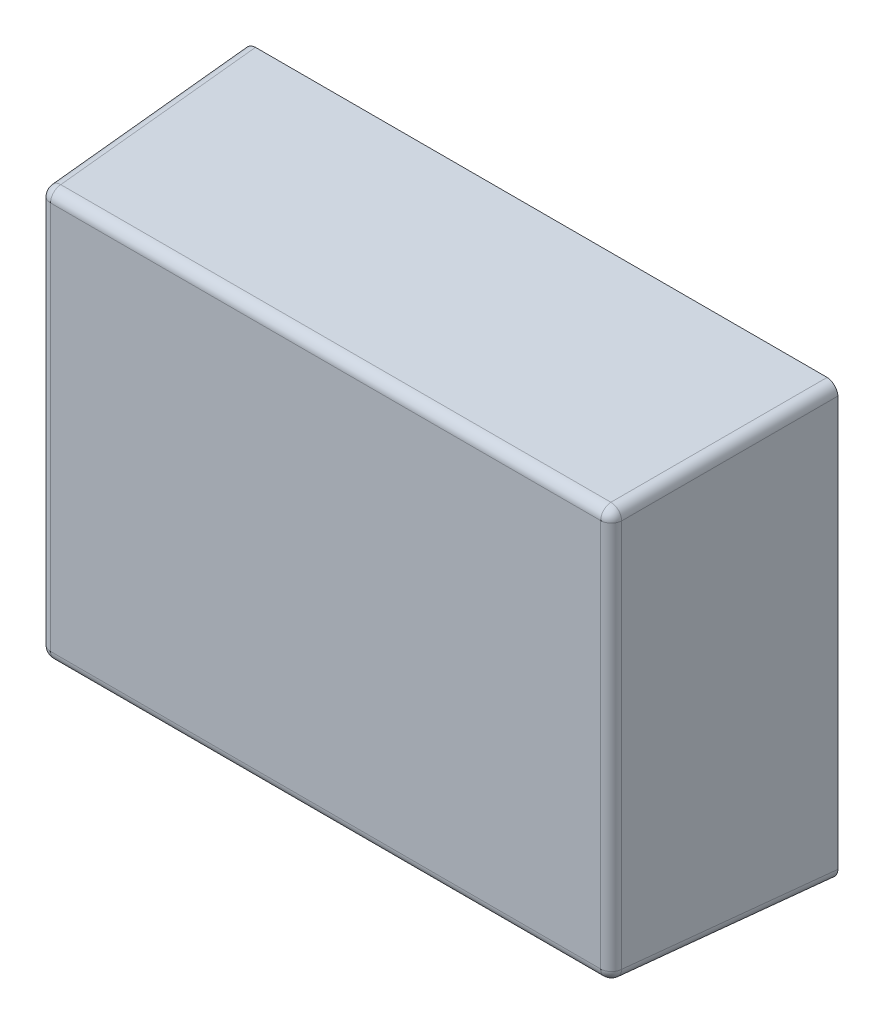
ISO-10303-21;
HEADER;
FILE_DESCRIPTION(('STEP AP214'),'2;1');
FILE_NAME('part.step','',(''),(''),'','','');
FILE_SCHEMA(('AUTOMOTIVE_DESIGN { 1 0 10303 214 1 1 1 1 }'));
ENDSEC;
DATA;
#1=APPLICATION_CONTEXT('core data for automotive mechanical design processes');
#2=APPLICATION_PROTOCOL_DEFINITION('international standard','automotive_design',2000,#1);
#3=PRODUCT_CONTEXT('',#1,'mechanical');
#4=PRODUCT('Part','Part','',(#3));
#5=PRODUCT_RELATED_PRODUCT_CATEGORY('part','',(#4));
#6=PRODUCT_DEFINITION_FORMATION('','',#4);
#7=PRODUCT_DEFINITION_CONTEXT('part definition',#1,'design');
#8=PRODUCT_DEFINITION('design','',#6,#7);
#9=PRODUCT_DEFINITION_SHAPE('','',#8);
#10=(LENGTH_UNIT() NAMED_UNIT(*) SI_UNIT(.MILLI.,.METRE.));
#11=(NAMED_UNIT(*) PLANE_ANGLE_UNIT() SI_UNIT($,.RADIAN.));
#12=(NAMED_UNIT(*) SI_UNIT($,.STERADIAN.) SOLID_ANGLE_UNIT());
#13=UNCERTAINTY_MEASURE_WITH_UNIT(LENGTH_MEASURE(1.E-05),#10,'distance_accuracy_value','');
#14=(GEOMETRIC_REPRESENTATION_CONTEXT(3) GLOBAL_UNCERTAINTY_ASSIGNED_CONTEXT((#13)) GLOBAL_UNIT_ASSIGNED_CONTEXT((#10,
#11,#12)) REPRESENTATION_CONTEXT('',''));
#15=CARTESIAN_POINT('',(0.,0.,0.));
#16=DIRECTION('',(0.,0.,1.));
#17=DIRECTION('',(1.,0.,0.));
#18=AXIS2_PLACEMENT_3D('',#15,#16,#17);
#19=CARTESIAN_POINT('',(-0.55,0.,0.));
#20=DIRECTION('',(-0.998629534754574,0.,0.0523359562429438));
#21=DIRECTION('',(0.0523359562429438,0.,0.998629534754574));
#22=AXIS2_PLACEMENT_3D('',#19,#20,#21);
#23=PLANE('',#22);
#24=DIRECTION('',(0.,-1.,0.));
#25=VECTOR('',#24,1.);
#26=CARTESIAN_POINT('',(-0.530030187647572,0.379036888286784,0.381046719124859));
#27=LINE('',#26,#25);
#28=CARTESIAN_POINT('',(-0.530030187647572,0.360057596952486,0.381046719124859));
#29=VERTEX_POINT('',#28);
#30=CARTESIAN_POINT('',(-0.530030187647572,-0.360057596952486,0.381046719124859));
#31=VERTEX_POINT('',#30);
#32=EDGE_CURVE('E11',#29,#31,#27,.T.);
#33=ORIENTED_EDGE('',*,*,#32,.F.);
#34=DIRECTION('',(0.0522644276887139,-0.0522644276887139,0.997264688634237));
#35=VECTOR('',#34,1.);
#36=CARTESIAN_POINT('',(-0.54896192837693,0.378989337681844,0.0198075865313544));
#37=LINE('',#36,#35);
#38=CARTESIAN_POINT('',(-0.55,0.380027409304909,0.));
#39=VERTEX_POINT('',#38);
#40=EDGE_CURVE('E24',#39,#29,#37,.T.);
#41=ORIENTED_EDGE('',*,*,#40,.F.);
#42=DIRECTION('',(0.,1.,0.));
#43=VECTOR('',#42,1.);
#44=CARTESIAN_POINT('',(-0.55,0.,0.));
#45=LINE('',#44,#43);
#46=CARTESIAN_POINT('',(-0.55,-0.380027409304909,0.));
#47=VERTEX_POINT('',#46);
#48=EDGE_CURVE('E261',#47,#39,#45,.T.);
#49=ORIENTED_EDGE('',*,*,#48,.F.);
#50=DIRECTION('',(0.0522644276887139,0.0522644276887139,0.997264688634237));
#51=VECTOR('',#50,1.);
#52=CARTESIAN_POINT('',(-0.54896192837693,-0.378989337681844,0.0198075865313544));
#53=LINE('',#52,#51);
#54=EDGE_CURVE('E259',#47,#31,#53,.T.);
#55=ORIENTED_EDGE('',*,*,#54,.T.);
#56=EDGE_LOOP('',(#33,#41,#49,#55));
#57=FACE_BOUND('',#56,.T.);
#58=ADVANCED_FACE('F17',(#57),#23,.T.);
#59=CARTESIAN_POINT('',(-0.528579602121594,-0.378579602121599,0.0265790876373401));
#60=DIRECTION('',(0.0522644276887139,0.0522644276887139,0.997264688634237));
#61=DIRECTION('',(-0.998629534754574,0.,0.0523359562429438));
#62=AXIS2_PLACEMENT_3D('',#59,#60,#61);
#63=CYLINDRICAL_SURFACE('',#62,0.02);
#64=CARTESIAN_POINT('',(-0.530030187647572,-0.360057596952486,0.381046719124859));
#65=CARTESIAN_POINT('',(-0.530030194579835,-0.360384398033548,0.381046719124859));
#66=CARTESIAN_POINT('',(-0.530022166997183,-0.360711198524743,0.381046719124859));
#67=CARTESIAN_POINT('',(-0.529990092577585,-0.361364012531633,0.381046719124859));
#68=CARTESIAN_POINT('',(-0.529966045740639,-0.361690026047328,0.381046719124859));
#69=CARTESIAN_POINT('',(-0.529901982587984,-0.362340480307456,0.381046719124859));
#70=CARTESIAN_POINT('',(-0.529861966272275,-0.362664921051888,0.381046719124859));
#71=CARTESIAN_POINT('',(-0.529766062750138,-0.363311448270672,0.381046719124859));
#72=CARTESIAN_POINT('',(-0.529710175543711,-0.363633534745023,0.381046719124859));
#73=CARTESIAN_POINT('',(-0.52958266429178,-0.364274577460352,0.381046719124859));
#74=CARTESIAN_POINT('',(-0.529511040246277,-0.36459353370133,0.381046719124859));
#75=CARTESIAN_POINT('',(-0.529352228021688,-0.365227547564097,0.381046719124859));
#76=CARTESIAN_POINT('',(-0.529265039842601,-0.365542605185887,0.381046719124859));
#77=CARTESIAN_POINT('',(-0.529075309352766,-0.366168062806806,0.381046719124859));
#78=CARTESIAN_POINT('',(-0.528972767042018,-0.366478462805935,0.381046719124859));
#79=CARTESIAN_POINT('',(-0.52875257533353,-0.367093857401301,0.381046719124859));
#80=CARTESIAN_POINT('',(-0.528634925935792,-0.367398851997538,0.381046719124859));
#81=CARTESIAN_POINT('',(-0.528384803478011,-0.368002701028275,0.381046719124859));
#82=CARTESIAN_POINT('',(-0.528252330417968,-0.368301555462775,0.381046719124859));
#83=CARTESIAN_POINT('',(-0.527972879775593,-0.368892404203567,0.381046719124859));
#84=CARTESIAN_POINT('',(-0.52782590219326,-0.369184398509859,0.381046719124859));
#85=CARTESIAN_POINT('',(-0.527517796587957,-0.369760823554368,0.381046719124859));
#86=CARTESIAN_POINT('',(-0.527356668564986,-0.370045254292583,0.381046719124859));
#87=CARTESIAN_POINT('',(-0.527020650249986,-0.370605866982378,0.381046719124859));
#88=CARTESIAN_POINT('',(-0.526845759957957,-0.370882048933958,0.381046719124859));
#89=CARTESIAN_POINT('',(-0.526482638430856,-0.371425498703969,0.381046719124859));
#90=CARTESIAN_POINT('',(-0.526294407195784,-0.3716927665224,0.381046719124859));
#91=CARTESIAN_POINT('',(-0.525905057248134,-0.372217744154529,0.381046719124859));
#92=CARTESIAN_POINT('',(-0.525703938535556,-0.372475453968227,0.381046719124859));
#93=CARTESIAN_POINT('',(-0.525289298145488,-0.372980694745376,0.381046719124859));
#94=CARTESIAN_POINT('',(-0.525075776467998,-0.373228225708827,0.381046719124859));
#95=CARTESIAN_POINT('',(-0.524636844540528,-0.373712512461711,0.381046719124859));
#96=CARTESIAN_POINT('',(-0.524411434290549,-0.373949268251143,0.381046719124859));
#97=CARTESIAN_POINT('',(-0.523949268251138,-0.374411434290554,0.381046719124859));
#98=CARTESIAN_POINT('',(-0.523712512461706,-0.374636844540533,0.381046719124859));
#99=CARTESIAN_POINT('',(-0.523228225708822,-0.375075776468003,0.381046719124859));
#100=CARTESIAN_POINT('',(-0.522980694745371,-0.375289298145493,0.381046719124859));
#101=CARTESIAN_POINT('',(-0.522475453968222,-0.375703938535561,0.381046719124859));
#102=CARTESIAN_POINT('',(-0.522217744154524,-0.375905057248139,0.381046719124859));
#103=CARTESIAN_POINT('',(-0.521692766522394,-0.376294407195789,0.381046719124859));
#104=CARTESIAN_POINT('',(-0.521425498703963,-0.376482638430861,0.381046719124859));
#105=CARTESIAN_POINT('',(-0.520882048933953,-0.376845759957962,0.381046719124859));
#106=CARTESIAN_POINT('',(-0.520605866982373,-0.377020650249991,0.381046719124859));
#107=CARTESIAN_POINT('',(-0.520045254292578,-0.377356668564991,0.381046719124859));
#108=CARTESIAN_POINT('',(-0.519760823554362,-0.377517796587962,0.381046719124859));
#109=CARTESIAN_POINT('',(-0.519184398509854,-0.377825902193265,0.381046719124859));
#110=CARTESIAN_POINT('',(-0.518892404203562,-0.377972879775598,0.381046719124859));
#111=CARTESIAN_POINT('',(-0.518301555462769,-0.378252330417973,0.381046719124859));
#112=CARTESIAN_POINT('',(-0.51800270102827,-0.378384803478016,0.381046719124859));
#113=CARTESIAN_POINT('',(-0.517398851997533,-0.378634925935797,0.381046719124859));
#114=CARTESIAN_POINT('',(-0.517093857401296,-0.378752575333536,0.381046719124859));
#115=CARTESIAN_POINT('',(-0.51647846280593,-0.378972767042023,0.381046719124859));
#116=CARTESIAN_POINT('',(-0.516168062806801,-0.379075309352771,0.381046719124859));
#117=CARTESIAN_POINT('',(-0.515542605185882,-0.379265039842606,0.381046719124859));
#118=CARTESIAN_POINT('',(-0.515227547564092,-0.379352228021693,0.381046719124859));
#119=CARTESIAN_POINT('',(-0.514593533701325,-0.379511040246282,0.381046719124859));
#120=CARTESIAN_POINT('',(-0.514274577460347,-0.379582664291785,0.381046719124859));
#121=CARTESIAN_POINT('',(-0.513633534745018,-0.379710175543716,0.381046719124859));
#122=CARTESIAN_POINT('',(-0.513311448270666,-0.379766062750143,0.381046719124859));
#123=CARTESIAN_POINT('',(-0.512664921051883,-0.37986196627228,0.381046719124859));
#124=CARTESIAN_POINT('',(-0.51234048030745,-0.379901982587989,0.381046719124859));
#125=CARTESIAN_POINT('',(-0.511690026047323,-0.379966045740644,0.381046719124859));
#126=CARTESIAN_POINT('',(-0.511364012531628,-0.37999009257759,0.381046719124859));
#127=CARTESIAN_POINT('',(-0.510711198524738,-0.380022166997188,0.381046719124859));
#128=CARTESIAN_POINT('',(-0.510384398033543,-0.38003019457984,0.381046719124859));
#129=CARTESIAN_POINT('',(-0.510057596952481,-0.380030187647578,0.381046719124859));
#130=B_SPLINE_CURVE_WITH_KNOTS('',3,(#64,#65,#66,#67,#68,#69,#70,#71,#72,#73,#74,#75,#76,#77,
#78,#79,#80,#81,#82,#83,#84,#85,#86,#87,#88,#89,#90,#91,#92,#93,#94,#95,#96,#97,#98,#99,#100,
#101,#102,#103,#104,#105,#106,#107,#108,#109,#110,#111,#112,#113,#114,#115,#116,#117,#118,#119,
#120,#121,#122,#123,#124,#125,#126,#127,#128,#129),.UNSPECIFIED.,.F.,.F.,(4,2,2,2,2,2,2,2,2,2,2,
2,2,2,2,2,2,2,2,2,2,2,2,2,2,2,2,2,2,2,2,2,4),(0.,0.000980303824885641,0.00196060764977132,
0.00294091147465699,0.00392121529954265,0.00490151912442828,0.005881822949314,
0.00686212677419962,0.00784243059908532,0.00882273442397099,0.00980303824885664,
0.0107833420737423,0.011763645898628,0.0127439497235136,0.0137242535483993,0.014704557373285,
0.0156848611981706,0.0166651650230563,0.0176454688479419,0.0186257726728276,0.0196060764977132,
0.0205863803225989,0.0215666841474845,0.0225469879723702,0.0235272917972559,0.0245075956221416,
0.0254878994470273,0.0264682032719129,0.0274485070967985,0.0284288109216842,0.0294091147465698,
0.0303894185714555,0.0313697223963412),.UNSPECIFIED.);
#131=CARTESIAN_POINT('',(-0.510057596952481,-0.380030187647578,0.381046719124859));
#132=VERTEX_POINT('',#131);
#133=EDGE_CURVE('E246',#31,#132,#130,.T.);
#134=ORIENTED_EDGE('',*,*,#133,.F.);
#135=ORIENTED_EDGE('',*,*,#54,.F.);
#136=CARTESIAN_POINT('',(-0.530027409304903,-0.380027409304908,-0.00104671912485895));
#137=DIRECTION('',(0.0522644276887139,0.0522644276887139,0.997264688634237));
#138=DIRECTION('',(-0.998629534754574,0.,0.0523359562429439));
#139=AXIS2_PLACEMENT_3D('',#136,#137,#138);
#140=CIRCLE('',#139,0.02);
#141=CARTESIAN_POINT('',(-0.530027409304903,-0.4,0.));
#142=VERTEX_POINT('',#141);
#143=EDGE_CURVE('E217',#47,#142,#140,.T.);
#144=ORIENTED_EDGE('',*,*,#143,.T.);
#145=DIRECTION('',(0.0522644276887139,0.0522644276887139,0.997264688634237));
#146=VECTOR('',#145,1.);
#147=CARTESIAN_POINT('',(-0.528579602121594,-0.398552192816691,0.027625806762199));
#148=LINE('',#147,#146);
#149=EDGE_CURVE('E207',#142,#132,#148,.T.);
#150=ORIENTED_EDGE('',*,*,#149,.T.);
#151=EDGE_LOOP('',(#134,#135,#144,#150));
#152=FACE_BOUND('',#151,.T.);
#153=ADVANCED_FACE('F222',(#152),#63,.T.);
#154=CARTESIAN_POINT('',(0.528579602121603,0.378579602121599,0.0265790876373406));
#155=DIRECTION('',(-0.0522644276887139,-0.0522644276887139,0.997264688634237));
#156=DIRECTION('',(-0.998629534754574,0.,-0.0523359562429438));
#157=AXIS2_PLACEMENT_3D('',#154,#155,#156);
#158=CYLINDRICAL_SURFACE('',#157,0.02);
#159=CARTESIAN_POINT('',(0.530030187647581,0.360057596952486,0.381046719124859));
#160=CARTESIAN_POINT('',(0.530030194579844,0.360384398033548,0.381046719124859));
#161=CARTESIAN_POINT('',(0.530022166997192,0.360711198524743,0.381046719124859));
#162=CARTESIAN_POINT('',(0.529990092577594,0.361364012531633,0.381046719124859));
#163=CARTESIAN_POINT('',(0.529966045740648,0.361690026047328,0.381046719124859));
#164=CARTESIAN_POINT('',(0.529901982587993,0.362340480307456,0.381046719124859));
#165=CARTESIAN_POINT('',(0.529861966272284,0.362664921051888,0.381046719124859));
#166=CARTESIAN_POINT('',(0.529766062750147,0.363311448270672,0.381046719124859));
#167=CARTESIAN_POINT('',(0.52971017554372,0.363633534745023,0.381046719124859));
#168=CARTESIAN_POINT('',(0.529582664291789,0.364274577460352,0.381046719124859));
#169=CARTESIAN_POINT('',(0.529511040246286,0.36459353370133,0.381046719124859));
#170=CARTESIAN_POINT('',(0.529352228021697,0.365227547564097,0.381046719124859));
#171=CARTESIAN_POINT('',(0.52926503984261,0.365542605185887,0.381046719124859));
#172=CARTESIAN_POINT('',(0.529075309352775,0.366168062806806,0.381046719124859));
#173=CARTESIAN_POINT('',(0.528972767042027,0.366478462805935,0.381046719124859));
#174=CARTESIAN_POINT('',(0.528752575333539,0.367093857401301,0.381046719124859));
#175=CARTESIAN_POINT('',(0.528634925935801,0.367398851997538,0.381046719124859));
#176=CARTESIAN_POINT('',(0.52838480347802,0.368002701028275,0.381046719124859));
#177=CARTESIAN_POINT('',(0.528252330417977,0.368301555462775,0.381046719124859));
#178=CARTESIAN_POINT('',(0.527972879775602,0.368892404203567,0.381046719124859));
#179=CARTESIAN_POINT('',(0.527825902193269,0.369184398509859,0.381046719124859));
#180=CARTESIAN_POINT('',(0.527517796587965,0.369760823554368,0.381046719124859));
#181=CARTESIAN_POINT('',(0.527356668564995,0.370045254292583,0.381046719124859));
#182=CARTESIAN_POINT('',(0.527020650249995,0.370605866982378,0.381046719124859));
#183=CARTESIAN_POINT('',(0.526845759957966,0.370882048933958,0.381046719124859));
#184=CARTESIAN_POINT('',(0.526482638430865,0.371425498703969,0.381046719124859));
#185=CARTESIAN_POINT('',(0.526294407195793,0.3716927665224,0.381046719124859));
#186=CARTESIAN_POINT('',(0.525905057248143,0.372217744154529,0.381046719124859));
#187=CARTESIAN_POINT('',(0.525703938535565,0.372475453968227,0.381046719124859));
#188=CARTESIAN_POINT('',(0.525289298145497,0.372980694745376,0.381046719124859));
#189=CARTESIAN_POINT('',(0.525075776468007,0.373228225708827,0.381046719124859));
#190=CARTESIAN_POINT('',(0.524636844540537,0.373712512461711,0.381046719124859));
#191=CARTESIAN_POINT('',(0.524411434290558,0.373949268251143,0.381046719124859));
#192=CARTESIAN_POINT('',(0.523949268251147,0.374411434290554,0.381046719124859));
#193=CARTESIAN_POINT('',(0.523712512461715,0.374636844540533,0.381046719124859));
#194=CARTESIAN_POINT('',(0.523228225708831,0.375075776468003,0.381046719124859));
#195=CARTESIAN_POINT('',(0.52298069474538,0.375289298145493,0.381046719124859));
#196=CARTESIAN_POINT('',(0.522475453968231,0.375703938535561,0.381046719124859));
#197=CARTESIAN_POINT('',(0.522217744154533,0.375905057248139,0.381046719124859));
#198=CARTESIAN_POINT('',(0.521692766522403,0.376294407195789,0.381046719124859));
#199=CARTESIAN_POINT('',(0.521425498703972,0.376482638430861,0.381046719124859));
#200=CARTESIAN_POINT('',(0.520882048933962,0.376845759957962,0.381046719124859));
#201=CARTESIAN_POINT('',(0.520605866982382,0.377020650249991,0.381046719124859));
#202=CARTESIAN_POINT('',(0.520045254292587,0.377356668564991,0.381046719124859));
#203=CARTESIAN_POINT('',(0.519760823554371,0.377517796587962,0.381046719124859));
#204=CARTESIAN_POINT('',(0.519184398509863,0.377825902193265,0.381046719124859));
#205=CARTESIAN_POINT('',(0.518892404203571,0.377972879775598,0.381046719124859));
#206=CARTESIAN_POINT('',(0.518301555462779,0.378252330417973,0.381046719124859));
#207=CARTESIAN_POINT('',(0.518002701028279,0.378384803478016,0.381046719124859));
#208=CARTESIAN_POINT('',(0.517398851997542,0.378634925935797,0.381046719124859));
#209=CARTESIAN_POINT('',(0.517093857401305,0.378752575333535,0.381046719124859));
#210=CARTESIAN_POINT('',(0.516478462805939,0.378972767042023,0.381046719124859));
#211=CARTESIAN_POINT('',(0.51616806280681,0.379075309352771,0.381046719124859));
#212=CARTESIAN_POINT('',(0.515542605185891,0.379265039842606,0.381046719124859));
#213=CARTESIAN_POINT('',(0.515227547564101,0.379352228021693,0.381046719124859));
#214=CARTESIAN_POINT('',(0.514593533701334,0.379511040246282,0.381046719124859));
#215=CARTESIAN_POINT('',(0.514274577460356,0.379582664291785,0.381046719124859));
#216=CARTESIAN_POINT('',(0.513633534745027,0.379710175543716,0.381046719124859));
#217=CARTESIAN_POINT('',(0.513311448270675,0.379766062750143,0.381046719124859));
#218=CARTESIAN_POINT('',(0.512664921051892,0.37986196627228,0.381046719124859));
#219=CARTESIAN_POINT('',(0.512340480307459,0.379901982587989,0.381046719124859));
#220=CARTESIAN_POINT('',(0.511690026047332,0.379966045740644,0.381046719124859));
#221=CARTESIAN_POINT('',(0.511364012531637,0.37999009257759,0.381046719124859));
#222=CARTESIAN_POINT('',(0.510711198524747,0.380022166997188,0.381046719124859));
#223=CARTESIAN_POINT('',(0.510384398033552,0.38003019457984,0.381046719124859));
#224=CARTESIAN_POINT('',(0.51005759695249,0.380030187647578,0.381046719124859));
#225=B_SPLINE_CURVE_WITH_KNOTS('',3,(#159,#160,#161,#162,#163,#164,#165,#166,#167,#168,#169,
#170,#171,#172,#173,#174,#175,#176,#177,#178,#179,#180,#181,#182,#183,#184,#185,#186,#187,#188,
#189,#190,#191,#192,#193,#194,#195,#196,#197,#198,#199,#200,#201,#202,#203,#204,#205,#206,#207,
#208,#209,#210,#211,#212,#213,#214,#215,#216,#217,#218,#219,#220,#221,#222,#223,#224),
.UNSPECIFIED.,.F.,.F.,(4,2,2,2,2,2,2,2,2,2,2,2,2,2,2,2,2,2,2,2,2,2,2,2,2,2,2,2,2,2,2,2,4),(0.,
0.000980303824885641,0.00196060764977132,0.00294091147465699,0.00392121529954265,
0.00490151912442828,0.005881822949314,0.00686212677419962,0.00784243059908532,
0.00882273442397099,0.00980303824885664,0.0107833420737423,0.011763645898628,0.0127439497235136,
0.0137242535483993,0.014704557373285,0.0156848611981706,0.0166651650230563,0.017645468847942,
0.0186257726728276,0.0196060764977132,0.0205863803225989,0.0215666841474846,0.0225469879723702,
0.0235272917972559,0.0245075956221416,0.0254878994470273,0.0264682032719129,0.0274485070967985,
0.0284288109216843,0.0294091147465698,0.0303894185714555,0.0313697223963412),.UNSPECIFIED.);
#226=CARTESIAN_POINT('',(0.530030187647581,0.360057596952486,0.381046719124859));
#227=VERTEX_POINT('',#226);
#228=CARTESIAN_POINT('',(0.51005759695249,0.380030187647578,0.381046719124859));
#229=VERTEX_POINT('',#228);
#230=EDGE_CURVE('E330',#227,#229,#225,.T.);
#231=ORIENTED_EDGE('',*,*,#230,.F.);
#232=DIRECTION('',(-0.0522644276887139,-0.0522644276887139,0.997264688634237));
#233=VECTOR('',#232,1.);
#234=CARTESIAN_POINT('',(0.548961928376939,0.378989337681844,0.0198075865313544));
#235=LINE('',#234,#233);
#236=CARTESIAN_POINT('',(0.55,0.380027409304909,0.));
#237=VERTEX_POINT('',#236);
#238=EDGE_CURVE('E336',#237,#227,#235,.T.);
#239=ORIENTED_EDGE('',*,*,#238,.F.);
#240=CARTESIAN_POINT('',(0.530027409304912,0.380027409304908,-0.00104671912485891));
#241=DIRECTION('',(-0.0522644276887139,-0.0522644276887139,0.997264688634237));
#242=DIRECTION('',(0.998629534754574,0.,0.0523359562429459));
#243=AXIS2_PLACEMENT_3D('',#240,#241,#242);
#244=CIRCLE('',#243,0.02);
#245=CARTESIAN_POINT('',(0.530027409304912,0.4,0.));
#246=VERTEX_POINT('',#245);
#247=EDGE_CURVE('E340',#237,#246,#244,.T.);
#248=ORIENTED_EDGE('',*,*,#247,.T.);
#249=DIRECTION('',(-0.052264427688714,-0.0522644276887139,0.997264688634237));
#250=VECTOR('',#249,1.);
#251=CARTESIAN_POINT('',(0.528579602121603,0.398552192816691,0.0276258067621994));
#252=LINE('',#251,#250);
#253=EDGE_CURVE('E339',#246,#229,#252,.T.);
#254=ORIENTED_EDGE('',*,*,#253,.T.);
#255=EDGE_LOOP('',(#231,#239,#248,#254));
#256=FACE_BOUND('',#255,.T.);
#257=ADVANCED_FACE('F230',(#256),#158,.T.);
#258=CARTESIAN_POINT('',(0.,0.4,0.));
#259=DIRECTION('',(0.,0.998629534754574,0.0523359562429438));
#260=DIRECTION('',(0.,-0.0523359562429438,0.998629534754574));
#261=AXIS2_PLACEMENT_3D('',#258,#259,#260);
#262=PLANE('',#261);
#263=DIRECTION('',(-1.,0.,0.));
#264=VECTOR('',#263,1.);
#265=CARTESIAN_POINT('',(0.529036888286787,0.380030187647578,0.381046719124859));
#266=LINE('',#265,#264);
#267=CARTESIAN_POINT('',(-0.510057596952481,0.380030187647578,0.381046719124859));
#268=VERTEX_POINT('',#267);
#269=EDGE_CURVE('E119',#229,#268,#266,.T.);
#270=ORIENTED_EDGE('',*,*,#269,.F.);
#271=ORIENTED_EDGE('',*,*,#253,.F.);
#272=DIRECTION('',(1.,0.,0.));
#273=VECTOR('',#272,1.);
#274=CARTESIAN_POINT('',(0.,0.4,0.));
#275=LINE('',#274,#273);
#276=CARTESIAN_POINT('',(-0.530027409304903,0.4,0.));
#277=VERTEX_POINT('',#276);
#278=EDGE_CURVE('E270',#277,#246,#275,.T.);
#279=ORIENTED_EDGE('',*,*,#278,.F.);
#280=DIRECTION('',(0.0522644276887139,-0.0522644276887139,0.997264688634237));
#281=VECTOR('',#280,1.);
#282=CARTESIAN_POINT('',(-0.528579602121594,0.398552192816691,0.027625806762199));
#283=LINE('',#282,#281);
#284=EDGE_CURVE('E343',#277,#268,#283,.T.);
#285=ORIENTED_EDGE('',*,*,#284,.T.);
#286=EDGE_LOOP('',(#270,#271,#279,#285));
#287=FACE_BOUND('',#286,.T.);
#288=ADVANCED_FACE('F186',(#287),#262,.T.);
#289=CARTESIAN_POINT('',(-0.55,-0.4,0.));
#290=DIRECTION('',(0.,0.,1.));
#291=DIRECTION('',(1.,0.,0.));
#292=AXIS2_PLACEMENT_3D('',#289,#290,#291);
#293=PLANE('',#292);
#294=ORIENTED_EDGE('',*,*,#278,.T.);
#295=ORIENTED_EDGE('',*,*,#247,.F.);
#296=DIRECTION('',(0.,-1.,0.));
#297=VECTOR('',#296,1.);
#298=CARTESIAN_POINT('',(0.55,0.,0.));
#299=LINE('',#298,#297);
#300=CARTESIAN_POINT('',(0.55,-0.380027409304909,0.));
#301=VERTEX_POINT('',#300);
#302=EDGE_CURVE('E354',#237,#301,#299,.T.);
#303=ORIENTED_EDGE('',*,*,#302,.T.);
#304=CARTESIAN_POINT('',(0.530027409304912,-0.380027409304909,-0.00104671912485888));
#305=DIRECTION('',(-0.0522644276887139,0.0522644276887139,0.997264688634237));
#306=DIRECTION('',(0.,-0.998629534754574,0.0523359562429444));
#307=AXIS2_PLACEMENT_3D('',#304,#305,#306);
#308=CIRCLE('',#307,0.02);
#309=CARTESIAN_POINT('',(0.530027409304912,-0.4,0.));
#310=VERTEX_POINT('',#309);
#311=EDGE_CURVE('E169',#310,#301,#308,.T.);
#312=ORIENTED_EDGE('',*,*,#311,.F.);
#313=DIRECTION('',(-1.,0.,0.));
#314=VECTOR('',#313,1.);
#315=CARTESIAN_POINT('',(0.,-0.4,0.));
#316=LINE('',#315,#314);
#317=EDGE_CURVE('E166',#310,#142,#316,.T.);
#318=ORIENTED_EDGE('',*,*,#317,.T.);
#319=ORIENTED_EDGE('',*,*,#143,.F.);
#320=ORIENTED_EDGE('',*,*,#48,.T.);
#321=CARTESIAN_POINT('',(-0.530027409304903,0.380027409304909,-0.00104671912485888));
#322=DIRECTION('',(0.0522644276887139,-0.0522644276887139,0.997264688634237));
#323=DIRECTION('',(0.,0.998629534754574,0.052335956242944));
#324=AXIS2_PLACEMENT_3D('',#321,#322,#323);
#325=CIRCLE('',#324,0.02);
#326=EDGE_CURVE('E163',#277,#39,#325,.T.);
#327=ORIENTED_EDGE('',*,*,#326,.F.);
#328=EDGE_LOOP('',(#294,#295,#303,#312,#318,#319,#320,#327));
#329=FACE_BOUND('',#328,.T.);
#330=ADVANCED_FACE('F175',(#329),#293,.F.);
#331=CARTESIAN_POINT('',(-0.510057596952481,-0.360057596952486,0.38));
#332=DIRECTION('',(0.,0.,1.));
#333=DIRECTION('',(1.,0.,0.));
#334=AXIS2_PLACEMENT_3D('',#331,#332,#333);
#335=SPHERICAL_SURFACE('',#334,0.02);
#336=CARTESIAN_POINT('',(-0.510057596952481,-0.360057596952486,0.38));
#337=DIRECTION('',(0.,-1.,0.));
#338=DIRECTION('',(0.,0.,-1.));
#339=AXIS2_PLACEMENT_3D('',#336,#337,#338);
#340=CIRCLE('',#339,0.02);
#341=CARTESIAN_POINT('',(-0.510057596952481,-0.360057596952486,0.4));
#342=VERTEX_POINT('',#341);
#343=EDGE_CURVE('E106',#342,#31,#340,.T.);
#344=ORIENTED_EDGE('',*,*,#343,.T.);
#345=ORIENTED_EDGE('',*,*,#133,.T.);
#346=CARTESIAN_POINT('',(-0.510057596952481,-0.360057596952486,0.38));
#347=DIRECTION('',(-1.,0.,0.));
#348=DIRECTION('',(0.,0.,1.));
#349=AXIS2_PLACEMENT_3D('',#346,#347,#348);
#350=CIRCLE('',#349,0.02);
#351=EDGE_CURVE('E271',#132,#342,#350,.T.);
#352=ORIENTED_EDGE('',*,*,#351,.T.);
#353=EDGE_LOOP('',(#344,#345,#352));
#354=FACE_BOUND('',#353,.T.);
#355=ADVANCED_FACE('F185',(#354),#335,.T.);
#356=CARTESIAN_POINT('',(0.,-0.4,0.));
#357=DIRECTION('',(0.,-0.998629534754574,0.0523359562429438));
#358=DIRECTION('',(0.,-0.0523359562429438,-0.998629534754574));
#359=AXIS2_PLACEMENT_3D('',#356,#357,#358);
#360=PLANE('',#359);
#361=ORIENTED_EDGE('',*,*,#317,.F.);
#362=DIRECTION('',(-0.0522644276887139,0.0522644276887139,0.997264688634237));
#363=VECTOR('',#362,1.);
#364=CARTESIAN_POINT('',(0.528579602121603,-0.398552192816691,0.0276258067621994));
#365=LINE('',#364,#363);
#366=CARTESIAN_POINT('',(0.510057596952489,-0.380030187647578,0.381046719124859));
#367=VERTEX_POINT('',#366);
#368=EDGE_CURVE('E272',#310,#367,#365,.T.);
#369=ORIENTED_EDGE('',*,*,#368,.T.);
#370=DIRECTION('',(1.,0.,0.));
#371=VECTOR('',#370,1.);
#372=CARTESIAN_POINT('',(-0.529036888286778,-0.380030187647578,0.381046719124859));
#373=LINE('',#372,#371);
#374=EDGE_CURVE('E280',#132,#367,#373,.T.);
#375=ORIENTED_EDGE('',*,*,#374,.F.);
#376=ORIENTED_EDGE('',*,*,#149,.F.);
#377=EDGE_LOOP('',(#361,#369,#375,#376));
#378=FACE_BOUND('',#377,.T.);
#379=ADVANCED_FACE('F377',(#378),#360,.T.);
#380=CARTESIAN_POINT('',(0.528989337681847,-0.378989337681844,0.0187608674064956));
#381=DIRECTION('',(-0.0522644276887139,0.0522644276887139,0.997264688634237));
#382=DIRECTION('',(0.,0.998629534754574,-0.0523359562429438));
#383=AXIS2_PLACEMENT_3D('',#380,#381,#382);
#384=CYLINDRICAL_SURFACE('',#383,0.02);
#385=ORIENTED_EDGE('',*,*,#311,.T.);
#386=DIRECTION('',(-0.0522644276887139,0.0522644276887139,0.997264688634237));
#387=VECTOR('',#386,1.);
#388=CARTESIAN_POINT('',(0.548961928376938,-0.378989337681844,0.0198075865313544));
#389=LINE('',#388,#387);
#390=CARTESIAN_POINT('',(0.530030187647581,-0.360057596952486,0.381046719124859));
#391=VERTEX_POINT('',#390);
#392=EDGE_CURVE('E285',#301,#391,#389,.T.);
#393=ORIENTED_EDGE('',*,*,#392,.T.);
#394=CARTESIAN_POINT('',(0.510057596952489,-0.360057596952486,0.38));
#395=DIRECTION('',(-0.0522644276887143,0.0522644276887141,0.997264688634237));
#396=DIRECTION('',(0.998629534754574,0.,0.0523359562429442));
#397=AXIS2_PLACEMENT_3D('',#394,#395,#396);
#398=CIRCLE('',#397,0.02);
#399=EDGE_CURVE('E289',#367,#391,#398,.T.);
#400=ORIENTED_EDGE('',*,*,#399,.F.);
#401=ORIENTED_EDGE('',*,*,#368,.F.);
#402=EDGE_LOOP('',(#385,#393,#400,#401));
#403=FACE_BOUND('',#402,.T.);
#404=ADVANCED_FACE('F367',(#403),#384,.T.);
#405=CARTESIAN_POINT('',(0.510057596952489,-0.360057596952486,0.38));
#406=DIRECTION('',(0.,0.,1.));
#407=DIRECTION('',(1.,0.,0.));
#408=AXIS2_PLACEMENT_3D('',#405,#406,#407);
#409=SPHERICAL_SURFACE('',#408,0.02);
#410=CARTESIAN_POINT('',(0.510057596952489,-0.360057596952486,0.38));
#411=DIRECTION('',(1.,0.,0.));
#412=DIRECTION('',(0.,1.,0.));
#413=AXIS2_PLACEMENT_3D('',#410,#411,#412);
#414=CIRCLE('',#413,0.02);
#415=CARTESIAN_POINT('',(0.510057596952489,-0.360057596952486,0.4));
#416=VERTEX_POINT('',#415);
#417=EDGE_CURVE('E294',#416,#367,#414,.T.);
#418=ORIENTED_EDGE('',*,*,#417,.T.);
#419=ORIENTED_EDGE('',*,*,#399,.T.);
#420=CARTESIAN_POINT('',(0.510057596952489,-0.360057596952486,0.38));
#421=DIRECTION('',(0.,-1.,0.));
#422=DIRECTION('',(0.,0.,-1.));
#423=AXIS2_PLACEMENT_3D('',#420,#421,#422);
#424=CIRCLE('',#423,0.02);
#425=EDGE_CURVE('E297',#391,#416,#424,.T.);
#426=ORIENTED_EDGE('',*,*,#425,.T.);
#427=EDGE_LOOP('',(#418,#419,#426));
#428=FACE_BOUND('',#427,.T.);
#429=ADVANCED_FACE('F376',(#428),#409,.T.);
#430=CARTESIAN_POINT('',(-0.55,-0.360057596952486,0.38));
#431=DIRECTION('',(-1.,0.,0.));
#432=DIRECTION('',(0.,1.,0.));
#433=AXIS2_PLACEMENT_3D('',#430,#431,#432);
#434=CYLINDRICAL_SURFACE('',#433,0.02);
#435=ORIENTED_EDGE('',*,*,#351,.F.);
#436=ORIENTED_EDGE('',*,*,#374,.T.);
#437=ORIENTED_EDGE('',*,*,#417,.F.);
#438=DIRECTION('',(-1.,0.,0.));
#439=VECTOR('',#438,1.);
#440=CARTESIAN_POINT('',(0.529036888286786,-0.360057596952486,0.4));
#441=LINE('',#440,#439);
#442=EDGE_CURVE('E300',#416,#342,#441,.T.);
#443=ORIENTED_EDGE('',*,*,#442,.T.);
#444=EDGE_LOOP('',(#435,#436,#437,#443));
#445=FACE_BOUND('',#444,.T.);
#446=ADVANCED_FACE('F442',(#445),#434,.T.);
#447=CARTESIAN_POINT('',(-0.55,-0.4,0.4));
#448=DIRECTION('',(0.,0.,1.));
#449=DIRECTION('',(1.,0.,0.));
#450=AXIS2_PLACEMENT_3D('',#447,#448,#449);
#451=PLANE('',#450);
#452=DIRECTION('',(0.,-1.,0.));
#453=VECTOR('',#452,1.);
#454=CARTESIAN_POINT('',(0.510057596952489,0.379036888286784,0.4));
#455=LINE('',#454,#453);
#456=CARTESIAN_POINT('',(0.510057596952489,0.360057596952486,0.4));
#457=VERTEX_POINT('',#456);
#458=EDGE_CURVE('E95',#457,#416,#455,.T.);
#459=ORIENTED_EDGE('',*,*,#458,.F.);
#460=DIRECTION('',(1.,0.,0.));
#461=VECTOR('',#460,1.);
#462=CARTESIAN_POINT('',(-0.529036888286778,0.360057596952486,0.4));
#463=LINE('',#462,#461);
#464=CARTESIAN_POINT('',(-0.510057596952481,0.360057596952486,0.4));
#465=VERTEX_POINT('',#464);
#466=EDGE_CURVE('E89',#465,#457,#463,.T.);
#467=ORIENTED_EDGE('',*,*,#466,.F.);
#468=DIRECTION('',(0.,1.,0.));
#469=VECTOR('',#468,1.);
#470=CARTESIAN_POINT('',(-0.510057596952481,-0.379036888286784,0.4));
#471=LINE('',#470,#469);
#472=EDGE_CURVE('E93',#342,#465,#471,.T.);
#473=ORIENTED_EDGE('',*,*,#472,.F.);
#474=ORIENTED_EDGE('',*,*,#442,.F.);
#475=EDGE_LOOP('',(#459,#467,#473,#474));
#476=FACE_BOUND('',#475,.T.);
#477=ADVANCED_FACE('F91',(#476),#451,.T.);
#478=CARTESIAN_POINT('',(-0.510057596952481,-0.4,0.38));
#479=DIRECTION('',(0.,1.,0.));
#480=DIRECTION('',(0.,0.,-1.));
#481=AXIS2_PLACEMENT_3D('',#478,#479,#480);
#482=CYLINDRICAL_SURFACE('',#481,0.02);
#483=ORIENTED_EDGE('',*,*,#343,.F.);
#484=ORIENTED_EDGE('',*,*,#472,.T.);
#485=CARTESIAN_POINT('',(-0.510057596952481,0.360057596952486,0.38));
#486=DIRECTION('',(0.,1.,0.));
#487=DIRECTION('',(0.,0.,1.));
#488=AXIS2_PLACEMENT_3D('',#485,#486,#487);
#489=CIRCLE('',#488,0.02);
#490=EDGE_CURVE('E103',#29,#465,#489,.T.);
#491=ORIENTED_EDGE('',*,*,#490,.F.);
#492=ORIENTED_EDGE('',*,*,#32,.T.);
#493=EDGE_LOOP('',(#483,#484,#491,#492));
#494=FACE_BOUND('',#493,.T.);
#495=ADVANCED_FACE('F102',(#494),#482,.T.);
#496=CARTESIAN_POINT('',(-0.528989337681838,0.378989337681844,0.0187608674064956));
#497=DIRECTION('',(0.0522644276887139,-0.0522644276887139,0.997264688634237));
#498=DIRECTION('',(-0.998629534754574,0.,0.0523359562429438));
#499=AXIS2_PLACEMENT_3D('',#496,#497,#498);
#500=CYLINDRICAL_SURFACE('',#499,0.02);
#501=ORIENTED_EDGE('',*,*,#326,.T.);
#502=ORIENTED_EDGE('',*,*,#40,.T.);
#503=CARTESIAN_POINT('',(-0.510057596952481,0.380030187647578,0.381046719124859));
#504=CARTESIAN_POINT('',(-0.510384398033543,0.38003019457984,0.381046719124859));
#505=CARTESIAN_POINT('',(-0.510711198524738,0.380022166997188,0.381046719124859));
#506=CARTESIAN_POINT('',(-0.511364012531627,0.37999009257759,0.381046719124859));
#507=CARTESIAN_POINT('',(-0.511690026047323,0.379966045740644,0.381046719124859));
#508=CARTESIAN_POINT('',(-0.51234048030745,0.379901982587989,0.381046719124859));
#509=CARTESIAN_POINT('',(-0.512664921051883,0.37986196627228,0.381046719124859));
#510=CARTESIAN_POINT('',(-0.513311448270666,0.379766062750143,0.381046719124859));
#511=CARTESIAN_POINT('',(-0.513633534745018,0.379710175543716,0.381046719124859));
#512=CARTESIAN_POINT('',(-0.514274577460347,0.379582664291785,0.381046719124859));
#513=CARTESIAN_POINT('',(-0.514593533701325,0.379511040246282,0.381046719124859));
#514=CARTESIAN_POINT('',(-0.515227547564092,0.379352228021693,0.381046719124859));
#515=CARTESIAN_POINT('',(-0.515542605185882,0.379265039842606,0.381046719124859));
#516=CARTESIAN_POINT('',(-0.516168062806801,0.379075309352771,0.381046719124859));
#517=CARTESIAN_POINT('',(-0.51647846280593,0.378972767042023,0.381046719124859));
#518=CARTESIAN_POINT('',(-0.517093857401296,0.378752575333535,0.381046719124859));
#519=CARTESIAN_POINT('',(-0.517398851997533,0.378634925935797,0.381046719124859));
#520=CARTESIAN_POINT('',(-0.51800270102827,0.378384803478016,0.381046719124859));
#521=CARTESIAN_POINT('',(-0.518301555462769,0.378252330417973,0.381046719124859));
#522=CARTESIAN_POINT('',(-0.518892404203562,0.377972879775598,0.381046719124859));
#523=CARTESIAN_POINT('',(-0.519184398509854,0.377825902193265,0.381046719124859));
#524=CARTESIAN_POINT('',(-0.519760823554362,0.377517796587962,0.381046719124859));
#525=CARTESIAN_POINT('',(-0.520045254292578,0.377356668564991,0.381046719124859));
#526=CARTESIAN_POINT('',(-0.520605866982373,0.377020650249991,0.381046719124859));
#527=CARTESIAN_POINT('',(-0.520882048933953,0.376845759957962,0.381046719124859));
#528=CARTESIAN_POINT('',(-0.521425498703963,0.376482638430861,0.381046719124859));
#529=CARTESIAN_POINT('',(-0.521692766522394,0.376294407195789,0.381046719124859));
#530=CARTESIAN_POINT('',(-0.522217744154523,0.375905057248139,0.381046719124859));
#531=CARTESIAN_POINT('',(-0.522475453968222,0.375703938535561,0.381046719124859));
#532=CARTESIAN_POINT('',(-0.522980694745371,0.375289298145493,0.381046719124859));
#533=CARTESIAN_POINT('',(-0.523228225708822,0.375075776468003,0.381046719124859));
#534=CARTESIAN_POINT('',(-0.523712512461706,0.374636844540533,0.381046719124859));
#535=CARTESIAN_POINT('',(-0.523949268251138,0.374411434290554,0.381046719124859));
#536=CARTESIAN_POINT('',(-0.524411434290549,0.373949268251143,0.381046719124859));
#537=CARTESIAN_POINT('',(-0.524636844540528,0.373712512461711,0.381046719124859));
#538=CARTESIAN_POINT('',(-0.525075776467998,0.373228225708827,0.381046719124859));
#539=CARTESIAN_POINT('',(-0.525289298145488,0.372980694745376,0.381046719124859));
#540=CARTESIAN_POINT('',(-0.525703938535556,0.372475453968227,0.381046719124859));
#541=CARTESIAN_POINT('',(-0.525905057248134,0.372217744154529,0.381046719124859));
#542=CARTESIAN_POINT('',(-0.526294407195784,0.3716927665224,0.381046719124859));
#543=CARTESIAN_POINT('',(-0.526482638430856,0.371425498703969,0.381046719124859));
#544=CARTESIAN_POINT('',(-0.526845759957957,0.370882048933958,0.381046719124859));
#545=CARTESIAN_POINT('',(-0.527020650249986,0.370605866982378,0.381046719124859));
#546=CARTESIAN_POINT('',(-0.527356668564986,0.370045254292583,0.381046719124859));
#547=CARTESIAN_POINT('',(-0.527517796587957,0.369760823554368,0.381046719124859));
#548=CARTESIAN_POINT('',(-0.52782590219326,0.369184398509859,0.381046719124859));
#549=CARTESIAN_POINT('',(-0.527972879775593,0.368892404203567,0.381046719124859));
#550=CARTESIAN_POINT('',(-0.528252330417968,0.368301555462775,0.381046719124859));
#551=CARTESIAN_POINT('',(-0.528384803478011,0.368002701028275,0.381046719124859));
#552=CARTESIAN_POINT('',(-0.528634925935792,0.367398851997538,0.381046719124859));
#553=CARTESIAN_POINT('',(-0.52875257533353,0.367093857401301,0.381046719124859));
#554=CARTESIAN_POINT('',(-0.528972767042018,0.366478462805935,0.381046719124859));
#555=CARTESIAN_POINT('',(-0.529075309352766,0.366168062806806,0.381046719124859));
#556=CARTESIAN_POINT('',(-0.529265039842601,0.365542605185887,0.381046719124859));
#557=CARTESIAN_POINT('',(-0.529352228021688,0.365227547564097,0.381046719124859));
#558=CARTESIAN_POINT('',(-0.529511040246277,0.36459353370133,0.381046719124859));
#559=CARTESIAN_POINT('',(-0.52958266429178,0.364274577460352,0.381046719124859));
#560=CARTESIAN_POINT('',(-0.529710175543711,0.363633534745023,0.381046719124859));
#561=CARTESIAN_POINT('',(-0.529766062750138,0.363311448270672,0.381046719124859));
#562=CARTESIAN_POINT('',(-0.529861966272275,0.362664921051888,0.381046719124859));
#563=CARTESIAN_POINT('',(-0.529901982587984,0.362340480307456,0.381046719124859));
#564=CARTESIAN_POINT('',(-0.529966045740639,0.361690026047328,0.381046719124859));
#565=CARTESIAN_POINT('',(-0.529990092577585,0.361364012531633,0.381046719124859));
#566=CARTESIAN_POINT('',(-0.530022166997183,0.360711198524743,0.381046719124859));
#567=CARTESIAN_POINT('',(-0.530030194579835,0.360384398033548,0.381046719124859));
#568=CARTESIAN_POINT('',(-0.530030187647572,0.360057596952486,0.381046719124859));
#569=B_SPLINE_CURVE_WITH_KNOTS('',3,(#503,#504,#505,#506,#507,#508,#509,#510,#511,#512,#513,
#514,#515,#516,#517,#518,#519,#520,#521,#522,#523,#524,#525,#526,#527,#528,#529,#530,#531,#532,
#533,#534,#535,#536,#537,#538,#539,#540,#541,#542,#543,#544,#545,#546,#547,#548,#549,#550,#551,
#552,#553,#554,#555,#556,#557,#558,#559,#560,#561,#562,#563,#564,#565,#566,#567,#568),
.UNSPECIFIED.,.F.,.F.,(4,2,2,2,2,2,2,2,2,2,2,2,2,2,2,2,2,2,2,2,2,2,2,2,2,2,2,2,2,2,2,2,4),(0.,
0.000980303824885693,0.00196060764977127,0.00294091147465694,0.0039212152995426,
0.0049015191244283,0.00588182294931394,0.00686212677419964,0.00784243059908532,
0.00882273442397096,0.0098030382488566,0.0107833420737423,0.011763645898628,0.0127439497235136,
0.0137242535483992,0.0147045573732849,0.0156848611981706,0.0166651650230563,0.017645468847942,
0.0186257726728276,0.0196060764977132,0.0205863803225989,0.0215666841474846,0.0225469879723702,
0.0235272917972559,0.0245075956221416,0.0254878994470272,0.0264682032719129,0.0274485070967986,
0.0284288109216842,0.0294091147465699,0.0303894185714556,0.0313697223963412),.UNSPECIFIED.);
#570=EDGE_CURVE('E114',#268,#29,#569,.T.);
#571=ORIENTED_EDGE('',*,*,#570,.F.);
#572=ORIENTED_EDGE('',*,*,#284,.F.);
#573=EDGE_LOOP('',(#501,#502,#571,#572));
#574=FACE_BOUND('',#573,.T.);
#575=ADVANCED_FACE('F133',(#574),#500,.T.);
#576=CARTESIAN_POINT('',(-0.510057596952481,0.360057596952486,0.38));
#577=DIRECTION('',(0.,0.,1.));
#578=DIRECTION('',(1.,0.,0.));
#579=AXIS2_PLACEMENT_3D('',#576,#577,#578);
#580=SPHERICAL_SURFACE('',#579,0.02);
#581=ORIENTED_EDGE('',*,*,#570,.T.);
#582=ORIENTED_EDGE('',*,*,#490,.T.);
#583=CARTESIAN_POINT('',(-0.510057596952481,0.360057596952486,0.38));
#584=DIRECTION('',(-1.,0.,0.));
#585=DIRECTION('',(0.,-1.,0.));
#586=AXIS2_PLACEMENT_3D('',#583,#584,#585);
#587=CIRCLE('',#586,0.02);
#588=EDGE_CURVE('E112',#465,#268,#587,.T.);
#589=ORIENTED_EDGE('',*,*,#588,.T.);
#590=EDGE_LOOP('',(#581,#582,#589));
#591=FACE_BOUND('',#590,.T.);
#592=ADVANCED_FACE('F111',(#591),#580,.T.);
#593=CARTESIAN_POINT('',(-0.55,0.360057596952486,0.38));
#594=DIRECTION('',(1.,0.,0.));
#595=DIRECTION('',(0.,-1.,0.));
#596=AXIS2_PLACEMENT_3D('',#593,#594,#595);
#597=CYLINDRICAL_SURFACE('',#596,0.02);
#598=ORIENTED_EDGE('',*,*,#588,.F.);
#599=ORIENTED_EDGE('',*,*,#466,.T.);
#600=CARTESIAN_POINT('',(0.51005759695249,0.360057596952486,0.38));
#601=DIRECTION('',(1.,0.,0.));
#602=DIRECTION('',(0.,0.,-1.));
#603=AXIS2_PLACEMENT_3D('',#600,#601,#602);
#604=CIRCLE('',#603,0.02);
#605=EDGE_CURVE('E121',#229,#457,#604,.T.);
#606=ORIENTED_EDGE('',*,*,#605,.F.);
#607=ORIENTED_EDGE('',*,*,#269,.T.);
#608=EDGE_LOOP('',(#598,#599,#606,#607));
#609=FACE_BOUND('',#608,.T.);
#610=ADVANCED_FACE('F117',(#609),#597,.T.);
#611=CARTESIAN_POINT('',(0.51005759695249,0.360057596952486,0.38));
#612=DIRECTION('',(0.,0.,1.));
#613=DIRECTION('',(1.,0.,0.));
#614=AXIS2_PLACEMENT_3D('',#611,#612,#613);
#615=SPHERICAL_SURFACE('',#614,0.02);
#616=ORIENTED_EDGE('',*,*,#605,.T.);
#617=CARTESIAN_POINT('',(0.510057596952489,0.360057596952486,0.38));
#618=DIRECTION('',(0.,1.,0.));
#619=DIRECTION('',(-1.,0.,0.));
#620=AXIS2_PLACEMENT_3D('',#617,#618,#619);
#621=CIRCLE('',#620,0.02);
#622=EDGE_CURVE('E123',#457,#227,#621,.T.);
#623=ORIENTED_EDGE('',*,*,#622,.T.);
#624=ORIENTED_EDGE('',*,*,#230,.T.);
#625=EDGE_LOOP('',(#616,#623,#624));
#626=FACE_BOUND('',#625,.T.);
#627=ADVANCED_FACE('F329',(#626),#615,.T.);
#628=CARTESIAN_POINT('',(0.510057596952489,-0.4,0.38));
#629=DIRECTION('',(0.,-1.,0.));
#630=DIRECTION('',(-1.,0.,0.));
#631=AXIS2_PLACEMENT_3D('',#628,#629,#630);
#632=CYLINDRICAL_SURFACE('',#631,0.02);
#633=ORIENTED_EDGE('',*,*,#425,.F.);
#634=DIRECTION('',(0.,1.,0.));
#635=VECTOR('',#634,1.);
#636=CARTESIAN_POINT('',(0.530030187647581,-0.379036888286784,0.381046719124859));
#637=LINE('',#636,#635);
#638=EDGE_CURVE('E319',#391,#227,#637,.T.);
#639=ORIENTED_EDGE('',*,*,#638,.T.);
#640=ORIENTED_EDGE('',*,*,#622,.F.);
#641=ORIENTED_EDGE('',*,*,#458,.T.);
#642=EDGE_LOOP('',(#633,#639,#640,#641));
#643=FACE_BOUND('',#642,.T.);
#644=ADVANCED_FACE('F315',(#643),#632,.T.);
#645=CARTESIAN_POINT('',(0.55,0.,0.));
#646=DIRECTION('',(0.998629534754574,0.,0.0523359562429438));
#647=DIRECTION('',(0.0523359562429438,0.,-0.998629534754574));
#648=AXIS2_PLACEMENT_3D('',#645,#646,#647);
#649=PLANE('',#648);
#650=ORIENTED_EDGE('',*,*,#302,.F.);
#651=ORIENTED_EDGE('',*,*,#238,.T.);
#652=ORIENTED_EDGE('',*,*,#638,.F.);
#653=ORIENTED_EDGE('',*,*,#392,.F.);
#654=EDGE_LOOP('',(#650,#651,#652,#653));
#655=FACE_BOUND('',#654,.T.);
#656=ADVANCED_FACE('F501',(#655),#649,.T.);
#657=CLOSED_SHELL('',(#58,#153,#257,#288,#330,#355,#379,#404,#429,#446,#477,#495,#575,#592,#610,
#627,#644,#656));
#658=MANIFOLD_SOLID_BREP('B1',#657);
#659=ADVANCED_BREP_SHAPE_REPRESENTATION('',(#18,#658),#14);
#660=SHAPE_DEFINITION_REPRESENTATION(#9,#659);
ENDSEC;
END-ISO-10303-21;
